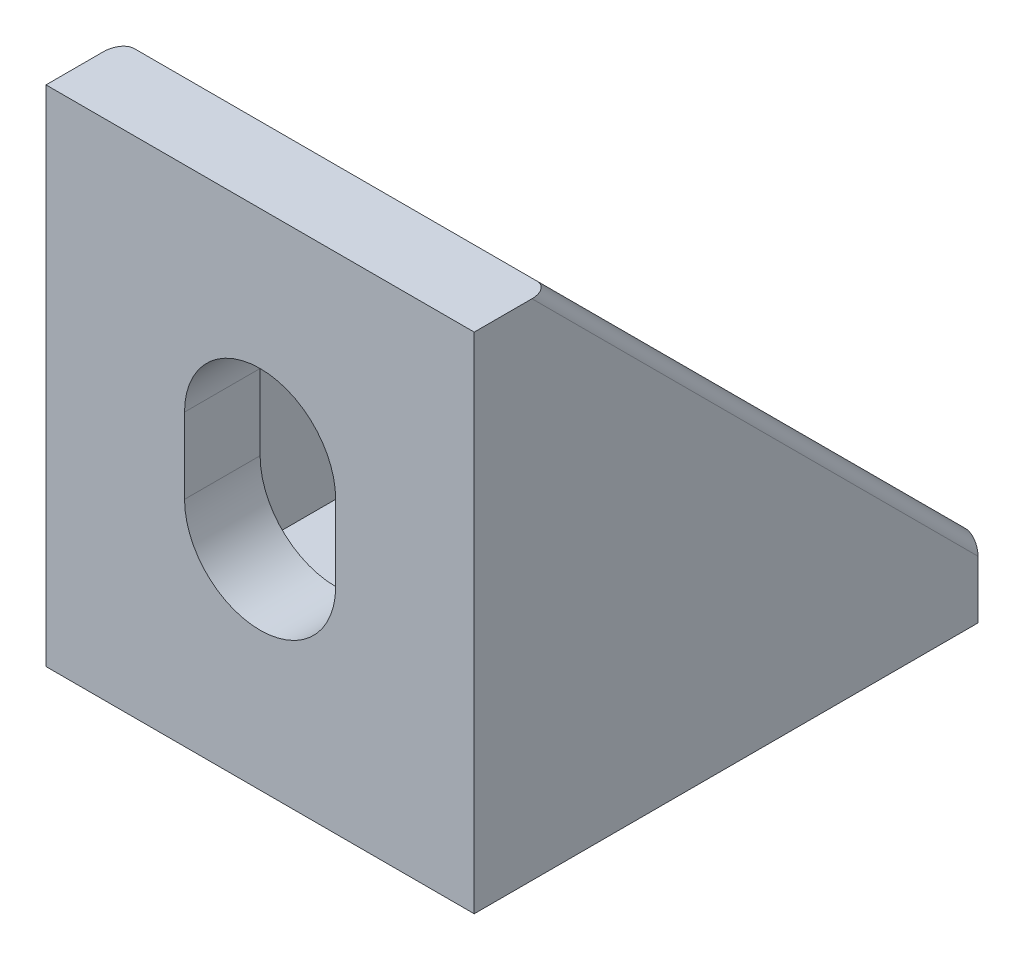
ISO-10303-21;
HEADER;
FILE_DESCRIPTION(('STEP AP214'),'2;1');
FILE_NAME('part.step','',(''),(''),'','','');
FILE_SCHEMA(('AUTOMOTIVE_DESIGN { 1 0 10303 214 1 1 1 1 }'));
ENDSEC;
DATA;
#1=APPLICATION_CONTEXT('core data for automotive mechanical design processes');
#2=APPLICATION_PROTOCOL_DEFINITION('international standard','automotive_design',2000,#1);
#3=PRODUCT_CONTEXT('',#1,'mechanical');
#4=PRODUCT('Part','Part','',(#3));
#5=PRODUCT_RELATED_PRODUCT_CATEGORY('part','',(#4));
#6=PRODUCT_DEFINITION_FORMATION('','',#4);
#7=PRODUCT_DEFINITION_CONTEXT('part definition',#1,'design');
#8=PRODUCT_DEFINITION('design','',#6,#7);
#9=PRODUCT_DEFINITION_SHAPE('','',#8);
#10=(LENGTH_UNIT() NAMED_UNIT(*) SI_UNIT(.MILLI.,.METRE.));
#11=(NAMED_UNIT(*) PLANE_ANGLE_UNIT() SI_UNIT($,.RADIAN.));
#12=(NAMED_UNIT(*) SI_UNIT($,.STERADIAN.) SOLID_ANGLE_UNIT());
#13=UNCERTAINTY_MEASURE_WITH_UNIT(LENGTH_MEASURE(1.E-05),#10,'distance_accuracy_value','');
#14=(GEOMETRIC_REPRESENTATION_CONTEXT(3) GLOBAL_UNCERTAINTY_ASSIGNED_CONTEXT((#13)) GLOBAL_UNIT_ASSIGNED_CONTEXT((#10,
#11,#12)) REPRESENTATION_CONTEXT('',''));
#15=CARTESIAN_POINT('',(0.,0.,0.));
#16=DIRECTION('',(0.,0.,1.));
#17=DIRECTION('',(1.,0.,0.));
#18=AXIS2_PLACEMENT_3D('',#15,#16,#17);
#19=CARTESIAN_POINT('',(8.5,3.,-3.));
#20=DIRECTION('',(0.,-1.,0.));
#21=DIRECTION('',(0.,0.,-1.));
#22=AXIS2_PLACEMENT_3D('',#19,#20,#21);
#23=PLANE('',#22);
#24=CARTESIAN_POINT('',(0.,3.,-8.5));
#25=DIRECTION('',(0.,1.,0.));
#26=DIRECTION('',(0.,0.,1.));
#27=AXIS2_PLACEMENT_3D('',#24,#25,#26);
#28=CIRCLE('',#27,3.);
#29=CARTESIAN_POINT('',(-3.00000000000009,3.,-8.5));
#30=VERTEX_POINT('',#29);
#31=CARTESIAN_POINT('',(3.,3.,-8.5));
#32=VERTEX_POINT('',#31);
#33=EDGE_CURVE('E239',#30,#32,#28,.T.);
#34=ORIENTED_EDGE('',*,*,#33,.F.);
#35=DIRECTION('',(0.,0.,-1.));
#36=VECTOR('',#35,1.);
#37=CARTESIAN_POINT('',(-3.,3.,-8.5));
#38=LINE('',#37,#36);
#39=CARTESIAN_POINT('',(-3.,3.,-11.5));
#40=VERTEX_POINT('',#39);
#41=EDGE_CURVE('E233',#30,#40,#38,.T.);
#42=ORIENTED_EDGE('',*,*,#41,.T.);
#43=CARTESIAN_POINT('',(0.,3.,-11.5));
#44=DIRECTION('',(0.,1.,0.));
#45=DIRECTION('',(0.,0.,1.));
#46=AXIS2_PLACEMENT_3D('',#43,#44,#45);
#47=CIRCLE('',#46,3.);
#48=CARTESIAN_POINT('',(3.,3.,-11.5));
#49=VERTEX_POINT('',#48);
#50=EDGE_CURVE('E251',#49,#40,#47,.T.);
#51=ORIENTED_EDGE('',*,*,#50,.F.);
#52=DIRECTION('',(0.,0.,-1.));
#53=VECTOR('',#52,1.);
#54=CARTESIAN_POINT('',(3.,3.,-8.5));
#55=LINE('',#54,#53);
#56=EDGE_CURVE('E224',#32,#49,#55,.T.);
#57=ORIENTED_EDGE('',*,*,#56,.F.);
#58=EDGE_LOOP('',(#34,#42,#51,#57));
#59=FACE_BOUND('',#58,.T.);
#60=DIRECTION('',(0.,0.,-1.));
#61=VECTOR('',#60,1.);
#62=CARTESIAN_POINT('',(-5.5,3.,-20.));
#63=LINE('',#62,#61);
#64=CARTESIAN_POINT('',(-5.5,3.,-3.5));
#65=VERTEX_POINT('',#64);
#66=CARTESIAN_POINT('',(-5.5,3.,-19.2928932188134));
#67=VERTEX_POINT('',#66);
#68=EDGE_CURVE('E187',#65,#67,#63,.T.);
#69=ORIENTED_EDGE('',*,*,#68,.F.);
#70=DIRECTION('',(-1.,0.,0.));
#71=VECTOR('',#70,1.);
#72=CARTESIAN_POINT('',(5.5,3.,-3.5));
#73=LINE('',#72,#71);
#74=CARTESIAN_POINT('',(5.5,3.,-3.5));
#75=VERTEX_POINT('',#74);
#76=EDGE_CURVE('E135',#65,#75,#73,.F.);
#77=ORIENTED_EDGE('',*,*,#76,.T.);
#78=DIRECTION('',(0.,0.,-1.));
#79=VECTOR('',#78,1.);
#80=CARTESIAN_POINT('',(5.5,3.,-20.));
#81=LINE('',#80,#79);
#82=CARTESIAN_POINT('',(5.5,3.,-19.2928932188134));
#83=VERTEX_POINT('',#82);
#84=EDGE_CURVE('E131',#75,#83,#81,.T.);
#85=ORIENTED_EDGE('',*,*,#84,.T.);
#86=CARTESIAN_POINT('',(6.,3.,-19.2928932188134));
#87=DIRECTION('',(0.,-1.,0.));
#88=DIRECTION('',(0.,0.,-1.));
#89=AXIS2_PLACEMENT_3D('',#86,#87,#88);
#90=ELLIPSE('',#89,0.707106781186548,0.5);
#91=CARTESIAN_POINT('',(6.,3.,-20.));
#92=VERTEX_POINT('',#91);
#93=EDGE_CURVE('E11',#83,#92,#90,.T.);
#94=ORIENTED_EDGE('',*,*,#93,.T.);
#95=DIRECTION('',(-1.,0.,0.));
#96=VECTOR('',#95,1.);
#97=CARTESIAN_POINT('',(8.5,3.,-20.));
#98=LINE('',#97,#96);
#99=CARTESIAN_POINT('',(-6.,3.,-20.));
#100=VERTEX_POINT('',#99);
#101=EDGE_CURVE('E32',#92,#100,#98,.T.);
#102=ORIENTED_EDGE('',*,*,#101,.T.);
#103=CARTESIAN_POINT('',(-6.,3.,-19.2928932188134));
#104=DIRECTION('',(0.,-1.,0.));
#105=DIRECTION('',(0.,0.,1.));
#106=AXIS2_PLACEMENT_3D('',#103,#104,#105);
#107=ELLIPSE('',#106,0.707106781186548,0.5);
#108=EDGE_CURVE('E106',#100,#67,#107,.T.);
#109=ORIENTED_EDGE('',*,*,#108,.T.);
#110=EDGE_LOOP('',(#69,#77,#85,#94,#102,#109));
#111=FACE_BOUND('',#110,.T.);
#112=ADVANCED_FACE('F17',(#59,#111),#23,.F.);
#113=CARTESIAN_POINT('',(8.5,20.,-3.));
#114=DIRECTION('',(0.,0.,1.));
#115=DIRECTION('',(1.,0.,0.));
#116=AXIS2_PLACEMENT_3D('',#113,#114,#115);
#117=PLANE('',#116);
#118=DIRECTION('',(0.,1.,0.));
#119=VECTOR('',#118,1.);
#120=CARTESIAN_POINT('',(3.,8.5,-3.));
#121=LINE('',#120,#119);
#122=CARTESIAN_POINT('',(3.,8.5,-3.));
#123=VERTEX_POINT('',#122);
#124=CARTESIAN_POINT('',(3.,11.5,-3.));
#125=VERTEX_POINT('',#124);
#126=EDGE_CURVE('E197',#123,#125,#121,.T.);
#127=ORIENTED_EDGE('',*,*,#126,.T.);
#128=CARTESIAN_POINT('',(0.,11.5,-3.));
#129=DIRECTION('',(0.,0.,-1.));
#130=DIRECTION('',(-1.,0.,0.));
#131=AXIS2_PLACEMENT_3D('',#128,#129,#130);
#132=CIRCLE('',#131,3.);
#133=CARTESIAN_POINT('',(-3.,11.5,-3.));
#134=VERTEX_POINT('',#133);
#135=EDGE_CURVE('E215',#134,#125,#132,.T.);
#136=ORIENTED_EDGE('',*,*,#135,.F.);
#137=DIRECTION('',(0.,1.,0.));
#138=VECTOR('',#137,1.);
#139=CARTESIAN_POINT('',(-3.,8.5,-3.));
#140=LINE('',#139,#138);
#141=CARTESIAN_POINT('',(-3.,8.5,-3.));
#142=VERTEX_POINT('',#141);
#143=EDGE_CURVE('E182',#142,#134,#140,.T.);
#144=ORIENTED_EDGE('',*,*,#143,.F.);
#145=CARTESIAN_POINT('',(0.,8.5,-3.));
#146=DIRECTION('',(0.,0.,-1.));
#147=DIRECTION('',(-1.,0.,0.));
#148=AXIS2_PLACEMENT_3D('',#145,#146,#147);
#149=CIRCLE('',#148,3.);
#150=EDGE_CURVE('E203',#123,#142,#149,.T.);
#151=ORIENTED_EDGE('',*,*,#150,.F.);
#152=EDGE_LOOP('',(#127,#136,#144,#151));
#153=FACE_BOUND('',#152,.T.);
#154=DIRECTION('',(0.,-1.,0.));
#155=VECTOR('',#154,1.);
#156=CARTESIAN_POINT('',(5.5,3.,-3.));
#157=LINE('',#156,#155);
#158=CARTESIAN_POINT('',(5.5,19.2928932188134,-3.));
#159=VERTEX_POINT('',#158);
#160=CARTESIAN_POINT('',(5.5,3.5,-3.));
#161=VERTEX_POINT('',#160);
#162=EDGE_CURVE('E114',#159,#161,#157,.T.);
#163=ORIENTED_EDGE('',*,*,#162,.T.);
#164=DIRECTION('',(-1.,0.,0.));
#165=VECTOR('',#164,1.);
#166=CARTESIAN_POINT('',(-5.5,3.5,-3.));
#167=LINE('',#166,#165);
#168=CARTESIAN_POINT('',(-5.5,3.5,-3.));
#169=VERTEX_POINT('',#168);
#170=EDGE_CURVE('E282',#161,#169,#167,.T.);
#171=ORIENTED_EDGE('',*,*,#170,.T.);
#172=DIRECTION('',(0.,-1.,0.));
#173=VECTOR('',#172,1.);
#174=CARTESIAN_POINT('',(-5.5,3.,-3.));
#175=LINE('',#174,#173);
#176=CARTESIAN_POINT('',(-5.5,19.2928932188134,-3.));
#177=VERTEX_POINT('',#176);
#178=EDGE_CURVE('E297',#177,#169,#175,.T.);
#179=ORIENTED_EDGE('',*,*,#178,.F.);
#180=CARTESIAN_POINT('',(-6.,19.2928932188134,-3.));
#181=DIRECTION('',(0.,0.,1.));
#182=DIRECTION('',(0.,1.,0.));
#183=AXIS2_PLACEMENT_3D('',#180,#181,#182);
#184=ELLIPSE('',#183,0.707106781186548,0.5);
#185=CARTESIAN_POINT('',(-6.,20.,-3.));
#186=VERTEX_POINT('',#185);
#187=EDGE_CURVE('E80',#177,#186,#184,.T.);
#188=ORIENTED_EDGE('',*,*,#187,.T.);
#189=DIRECTION('',(-1.,0.,0.));
#190=VECTOR('',#189,1.);
#191=CARTESIAN_POINT('',(8.5,20.,-3.));
#192=LINE('',#191,#190);
#193=CARTESIAN_POINT('',(6.,20.,-3.));
#194=VERTEX_POINT('',#193);
#195=EDGE_CURVE('E41',#194,#186,#192,.T.);
#196=ORIENTED_EDGE('',*,*,#195,.F.);
#197=CARTESIAN_POINT('',(6.,19.2928932188134,-3.));
#198=DIRECTION('',(0.,0.,1.));
#199=DIRECTION('',(0.,-1.,0.));
#200=AXIS2_PLACEMENT_3D('',#197,#198,#199);
#201=ELLIPSE('',#200,0.707106781186548,0.5);
#202=EDGE_CURVE('E25',#194,#159,#201,.T.);
#203=ORIENTED_EDGE('',*,*,#202,.T.);
#204=EDGE_LOOP('',(#163,#171,#179,#188,#196,#203));
#205=FACE_BOUND('',#204,.T.);
#206=ADVANCED_FACE('F111',(#153,#205),#117,.F.);
#207=CARTESIAN_POINT('',(8.5,20.,0.));
#208=DIRECTION('',(0.,0.,-1.));
#209=DIRECTION('',(0.,1.,0.));
#210=AXIS2_PLACEMENT_3D('',#207,#208,#209);
#211=PLANE('',#210);
#212=DIRECTION('',(0.,-1.,0.));
#213=VECTOR('',#212,1.);
#214=CARTESIAN_POINT('',(-8.5,20.,0.));
#215=LINE('',#214,#213);
#216=CARTESIAN_POINT('',(-8.5,20.,0.));
#217=VERTEX_POINT('',#216);
#218=CARTESIAN_POINT('',(-8.5,0.,0.));
#219=VERTEX_POINT('',#218);
#220=EDGE_CURVE('E168',#217,#219,#215,.T.);
#221=ORIENTED_EDGE('',*,*,#220,.T.);
#222=DIRECTION('',(-1.,0.,0.));
#223=VECTOR('',#222,1.);
#224=CARTESIAN_POINT('',(8.5,0.,0.));
#225=LINE('',#224,#223);
#226=CARTESIAN_POINT('',(8.5,0.,0.));
#227=VERTEX_POINT('',#226);
#228=EDGE_CURVE('E279',#227,#219,#225,.T.);
#229=ORIENTED_EDGE('',*,*,#228,.F.);
#230=DIRECTION('',(0.,-1.,0.));
#231=VECTOR('',#230,1.);
#232=CARTESIAN_POINT('',(8.5,20.,0.));
#233=LINE('',#232,#231);
#234=CARTESIAN_POINT('',(8.5,20.,0.));
#235=VERTEX_POINT('',#234);
#236=EDGE_CURVE('E169',#235,#227,#233,.T.);
#237=ORIENTED_EDGE('',*,*,#236,.F.);
#238=DIRECTION('',(-1.,0.,0.));
#239=VECTOR('',#238,1.);
#240=CARTESIAN_POINT('',(8.5,20.,0.));
#241=LINE('',#240,#239);
#242=EDGE_CURVE('E270',#235,#217,#241,.T.);
#243=ORIENTED_EDGE('',*,*,#242,.T.);
#244=EDGE_LOOP('',(#221,#229,#237,#243));
#245=FACE_BOUND('',#244,.T.);
#246=DIRECTION('',(0.,1.,0.));
#247=VECTOR('',#246,1.);
#248=CARTESIAN_POINT('',(3.,8.5,0.));
#249=LINE('',#248,#247);
#250=CARTESIAN_POINT('',(3.,8.5,0.));
#251=VERTEX_POINT('',#250);
#252=CARTESIAN_POINT('',(3.,11.5,0.));
#253=VERTEX_POINT('',#252);
#254=EDGE_CURVE('E194',#251,#253,#249,.T.);
#255=ORIENTED_EDGE('',*,*,#254,.F.);
#256=CARTESIAN_POINT('',(0.,8.5,0.));
#257=DIRECTION('',(0.,0.,-1.));
#258=DIRECTION('',(-1.,0.,0.));
#259=AXIS2_PLACEMENT_3D('',#256,#257,#258);
#260=CIRCLE('',#259,3.);
#261=CARTESIAN_POINT('',(-3.,8.5,0.));
#262=VERTEX_POINT('',#261);
#263=EDGE_CURVE('E206',#251,#262,#260,.T.);
#264=ORIENTED_EDGE('',*,*,#263,.T.);
#265=DIRECTION('',(0.,1.,0.));
#266=VECTOR('',#265,1.);
#267=CARTESIAN_POINT('',(-3.,8.5,0.));
#268=LINE('',#267,#266);
#269=CARTESIAN_POINT('',(-3.,11.5,0.));
#270=VERTEX_POINT('',#269);
#271=EDGE_CURVE('E185',#262,#270,#268,.T.);
#272=ORIENTED_EDGE('',*,*,#271,.T.);
#273=CARTESIAN_POINT('',(0.,11.5,0.));
#274=DIRECTION('',(0.,0.,-1.));
#275=DIRECTION('',(-1.,0.,0.));
#276=AXIS2_PLACEMENT_3D('',#273,#274,#275);
#277=CIRCLE('',#276,3.);
#278=EDGE_CURVE('E218',#270,#253,#277,.T.);
#279=ORIENTED_EDGE('',*,*,#278,.T.);
#280=EDGE_LOOP('',(#255,#264,#272,#279));
#281=FACE_BOUND('',#280,.T.);
#282=ADVANCED_FACE('F382',(#245,#281),#211,.F.);
#283=CARTESIAN_POINT('',(8.5,0.,0.));
#284=DIRECTION('',(0.,1.,0.));
#285=DIRECTION('',(0.,0.,1.));
#286=AXIS2_PLACEMENT_3D('',#283,#284,#285);
#287=PLANE('',#286);
#288=DIRECTION('',(0.,0.,-1.));
#289=VECTOR('',#288,1.);
#290=CARTESIAN_POINT('',(3.,0.,-8.5));
#291=LINE('',#290,#289);
#292=CARTESIAN_POINT('',(3.,0.,-8.5));
#293=VERTEX_POINT('',#292);
#294=CARTESIAN_POINT('',(3.,0.,-11.5));
#295=VERTEX_POINT('',#294);
#296=EDGE_CURVE('E227',#293,#295,#291,.T.);
#297=ORIENTED_EDGE('',*,*,#296,.T.);
#298=CARTESIAN_POINT('',(0.,0.,-11.5));
#299=DIRECTION('',(0.,1.,0.));
#300=DIRECTION('',(0.,0.,1.));
#301=AXIS2_PLACEMENT_3D('',#298,#299,#300);
#302=CIRCLE('',#301,3.);
#303=CARTESIAN_POINT('',(-3.,0.,-11.5));
#304=VERTEX_POINT('',#303);
#305=EDGE_CURVE('E254',#295,#304,#302,.T.);
#306=ORIENTED_EDGE('',*,*,#305,.T.);
#307=DIRECTION('',(0.,0.,-1.));
#308=VECTOR('',#307,1.);
#309=CARTESIAN_POINT('',(-3.,0.,-8.5));
#310=LINE('',#309,#308);
#311=CARTESIAN_POINT('',(-3.,0.,-8.5));
#312=VERTEX_POINT('',#311);
#313=EDGE_CURVE('E230',#312,#304,#310,.T.);
#314=ORIENTED_EDGE('',*,*,#313,.F.);
#315=CARTESIAN_POINT('',(0.,0.,-8.5));
#316=DIRECTION('',(0.,1.,0.));
#317=DIRECTION('',(0.,0.,1.));
#318=AXIS2_PLACEMENT_3D('',#315,#316,#317);
#319=CIRCLE('',#318,3.);
#320=EDGE_CURVE('E242',#312,#293,#319,.T.);
#321=ORIENTED_EDGE('',*,*,#320,.T.);
#322=EDGE_LOOP('',(#297,#306,#314,#321));
#323=FACE_BOUND('',#322,.T.);
#324=DIRECTION('',(0.,0.,-1.));
#325=VECTOR('',#324,1.);
#326=CARTESIAN_POINT('',(-8.5,0.,0.));
#327=LINE('',#326,#325);
#328=CARTESIAN_POINT('',(-8.5,0.,-20.));
#329=VERTEX_POINT('',#328);
#330=EDGE_CURVE('E272',#219,#329,#327,.T.);
#331=ORIENTED_EDGE('',*,*,#330,.T.);
#332=DIRECTION('',(-1.,0.,0.));
#333=VECTOR('',#332,1.);
#334=CARTESIAN_POINT('',(8.5,0.,-20.));
#335=LINE('',#334,#333);
#336=CARTESIAN_POINT('',(8.5,0.,-20.));
#337=VERTEX_POINT('',#336);
#338=EDGE_CURVE('E88',#337,#329,#335,.T.);
#339=ORIENTED_EDGE('',*,*,#338,.F.);
#340=DIRECTION('',(0.,0.,-1.));
#341=VECTOR('',#340,1.);
#342=CARTESIAN_POINT('',(8.5,0.,0.));
#343=LINE('',#342,#341);
#344=EDGE_CURVE('E262',#227,#337,#343,.T.);
#345=ORIENTED_EDGE('',*,*,#344,.F.);
#346=ORIENTED_EDGE('',*,*,#228,.T.);
#347=EDGE_LOOP('',(#331,#339,#345,#346));
#348=FACE_BOUND('',#347,.T.);
#349=ADVANCED_FACE('F384',(#323,#348),#287,.F.);
#350=CARTESIAN_POINT('',(8.5,0.,-20.));
#351=DIRECTION('',(0.,0.,1.));
#352=DIRECTION('',(1.,0.,0.));
#353=AXIS2_PLACEMENT_3D('',#350,#351,#352);
#354=PLANE('',#353);
#355=DIRECTION('',(0.,1.,0.));
#356=VECTOR('',#355,1.);
#357=CARTESIAN_POINT('',(-8.5,0.,-20.));
#358=LINE('',#357,#356);
#359=CARTESIAN_POINT('',(-8.5,2.29289321881346,-20.));
#360=VERTEX_POINT('',#359);
#361=EDGE_CURVE('E170',#329,#360,#358,.T.);
#362=ORIENTED_EDGE('',*,*,#361,.T.);
#363=CARTESIAN_POINT('',(-8.,2.29289321881346,-20.));
#364=DIRECTION('',(0.,0.,1.));
#365=DIRECTION('',(0.,1.,0.));
#366=AXIS2_PLACEMENT_3D('',#363,#364,#365);
#367=ELLIPSE('',#366,0.707106781186548,0.5);
#368=CARTESIAN_POINT('',(-8.,3.,-20.));
#369=VERTEX_POINT('',#368);
#370=EDGE_CURVE('E94',#360,#369,#367,.F.);
#371=ORIENTED_EDGE('',*,*,#370,.T.);
#372=DIRECTION('',(-1.,0.,0.));
#373=VECTOR('',#372,1.);
#374=CARTESIAN_POINT('',(-5.5,3.,-20.));
#375=LINE('',#374,#373);
#376=EDGE_CURVE('E175',#100,#369,#375,.T.);
#377=ORIENTED_EDGE('',*,*,#376,.F.);
#378=ORIENTED_EDGE('',*,*,#101,.F.);
#379=CARTESIAN_POINT('',(8.,3.,-20.));
#380=VERTEX_POINT('',#379);
#381=EDGE_CURVE('E76',#380,#92,#98,.T.);
#382=ORIENTED_EDGE('',*,*,#381,.F.);
#383=CARTESIAN_POINT('',(8.,2.29289321881345,-20.));
#384=DIRECTION('',(0.,0.,1.));
#385=DIRECTION('',(0.,1.,0.));
#386=AXIS2_PLACEMENT_3D('',#383,#384,#385);
#387=ELLIPSE('',#386,0.707106781186548,0.5);
#388=CARTESIAN_POINT('',(8.5,2.29289321881345,-20.));
#389=VERTEX_POINT('',#388);
#390=EDGE_CURVE('E86',#380,#389,#387,.F.);
#391=ORIENTED_EDGE('',*,*,#390,.T.);
#392=DIRECTION('',(0.,1.,0.));
#393=VECTOR('',#392,1.);
#394=CARTESIAN_POINT('',(8.5,0.,-20.));
#395=LINE('',#394,#393);
#396=EDGE_CURVE('E265',#337,#389,#395,.T.);
#397=ORIENTED_EDGE('',*,*,#396,.F.);
#398=ORIENTED_EDGE('',*,*,#338,.T.);
#399=EDGE_LOOP('',(#362,#371,#377,#378,#382,#391,#397,#398));
#400=FACE_BOUND('',#399,.T.);
#401=ADVANCED_FACE('F84',(#400),#354,.F.);
#402=CARTESIAN_POINT('',(8.5,20.,-3.));
#403=DIRECTION('',(0.,-1.,0.));
#404=DIRECTION('',(0.,0.,-1.));
#405=AXIS2_PLACEMENT_3D('',#402,#403,#404);
#406=PLANE('',#405);
#407=DIRECTION('',(-1.,0.,0.));
#408=VECTOR('',#407,1.);
#409=CARTESIAN_POINT('',(-5.5,20.,-3.));
#410=LINE('',#409,#408);
#411=CARTESIAN_POINT('',(-8.,20.,-3.));
#412=VERTEX_POINT('',#411);
#413=EDGE_CURVE('E158',#186,#412,#410,.T.);
#414=ORIENTED_EDGE('',*,*,#413,.T.);
#415=CARTESIAN_POINT('',(-8.,20.,-2.29289321881346));
#416=DIRECTION('',(0.,-1.,0.));
#417=DIRECTION('',(0.,0.,1.));
#418=AXIS2_PLACEMENT_3D('',#415,#416,#417);
#419=ELLIPSE('',#418,0.707106781186548,0.5);
#420=CARTESIAN_POINT('',(-8.5,20.,-2.29289321881346));
#421=VERTEX_POINT('',#420);
#422=EDGE_CURVE('E99',#412,#421,#419,.F.);
#423=ORIENTED_EDGE('',*,*,#422,.T.);
#424=DIRECTION('',(0.,0.,1.));
#425=VECTOR('',#424,1.);
#426=CARTESIAN_POINT('',(-8.5,20.,-3.));
#427=LINE('',#426,#425);
#428=EDGE_CURVE('E156',#421,#217,#427,.T.);
#429=ORIENTED_EDGE('',*,*,#428,.T.);
#430=ORIENTED_EDGE('',*,*,#242,.F.);
#431=DIRECTION('',(0.,0.,1.));
#432=VECTOR('',#431,1.);
#433=CARTESIAN_POINT('',(8.5,20.,-3.));
#434=LINE('',#433,#432);
#435=CARTESIAN_POINT('',(8.5,20.,-2.29289321881345));
#436=VERTEX_POINT('',#435);
#437=EDGE_CURVE('E267',#436,#235,#434,.T.);
#438=ORIENTED_EDGE('',*,*,#437,.F.);
#439=CARTESIAN_POINT('',(8.,20.,-2.29289321881345));
#440=DIRECTION('',(0.,-1.,0.));
#441=DIRECTION('',(0.,0.,1.));
#442=AXIS2_PLACEMENT_3D('',#439,#440,#441);
#443=ELLIPSE('',#442,0.707106781186548,0.5);
#444=CARTESIAN_POINT('',(8.,20.,-3.));
#445=VERTEX_POINT('',#444);
#446=EDGE_CURVE('E65',#436,#445,#443,.F.);
#447=ORIENTED_EDGE('',*,*,#446,.T.);
#448=EDGE_CURVE('E77',#445,#194,#192,.T.);
#449=ORIENTED_EDGE('',*,*,#448,.T.);
#450=ORIENTED_EDGE('',*,*,#195,.T.);
#451=EDGE_LOOP('',(#414,#423,#429,#430,#438,#447,#449,#450));
#452=FACE_BOUND('',#451,.T.);
#453=ADVANCED_FACE('F153',(#452),#406,.F.);
#454=CARTESIAN_POINT('',(8.5,0.,0.));
#455=DIRECTION('',(1.,0.,0.));
#456=DIRECTION('',(0.,0.,-1.));
#457=AXIS2_PLACEMENT_3D('',#454,#455,#456);
#458=PLANE('',#457);
#459=ORIENTED_EDGE('',*,*,#396,.T.);
#460=DIRECTION('',(0.,0.707106781186548,0.707106781186548));
#461=VECTOR('',#460,1.);
#462=CARTESIAN_POINT('',(8.5,11.1464466094067,-11.1464466094067));
#463=LINE('',#462,#461);
#464=EDGE_CURVE('E93',#389,#436,#463,.T.);
#465=ORIENTED_EDGE('',*,*,#464,.T.);
#466=ORIENTED_EDGE('',*,*,#437,.T.);
#467=ORIENTED_EDGE('',*,*,#236,.T.);
#468=ORIENTED_EDGE('',*,*,#344,.T.);
#469=EDGE_LOOP('',(#459,#465,#466,#467,#468));
#470=FACE_BOUND('',#469,.T.);
#471=ADVANCED_FACE('F411',(#470),#458,.T.);
#472=CARTESIAN_POINT('',(-8.5,0.,0.));
#473=DIRECTION('',(1.,0.,0.));
#474=DIRECTION('',(0.,0.,-1.));
#475=AXIS2_PLACEMENT_3D('',#472,#473,#474);
#476=PLANE('',#475);
#477=ORIENTED_EDGE('',*,*,#428,.F.);
#478=DIRECTION('',(0.,0.707106781186548,0.707106781186548));
#479=VECTOR('',#478,1.);
#480=CARTESIAN_POINT('',(-8.5,11.1464466094067,-11.1464466094067));
#481=LINE('',#480,#479);
#482=EDGE_CURVE('E95',#421,#360,#481,.F.);
#483=ORIENTED_EDGE('',*,*,#482,.T.);
#484=ORIENTED_EDGE('',*,*,#361,.F.);
#485=ORIENTED_EDGE('',*,*,#330,.F.);
#486=ORIENTED_EDGE('',*,*,#220,.F.);
#487=EDGE_LOOP('',(#477,#483,#484,#485,#486));
#488=FACE_BOUND('',#487,.T.);
#489=ADVANCED_FACE('F164',(#488),#476,.F.);
#490=CARTESIAN_POINT('',(5.5,20.,-3.));
#491=DIRECTION('',(0.,0.707106781186548,-0.707106781186548));
#492=DIRECTION('',(0.,0.707106781186548,0.707106781186548));
#493=AXIS2_PLACEMENT_3D('',#490,#491,#492);
#494=PLANE('',#493);
#495=ORIENTED_EDGE('',*,*,#448,.F.);
#496=DIRECTION('',(0.,0.707106781186548,0.707106781186548));
#497=VECTOR('',#496,1.);
#498=CARTESIAN_POINT('',(8.,20.,-3.));
#499=LINE('',#498,#497);
#500=EDGE_CURVE('E73',#445,#380,#499,.F.);
#501=ORIENTED_EDGE('',*,*,#500,.T.);
#502=ORIENTED_EDGE('',*,*,#381,.T.);
#503=DIRECTION('',(0.,0.707106781186548,0.707106781186548));
#504=VECTOR('',#503,1.);
#505=CARTESIAN_POINT('',(6.,20.,-3.));
#506=LINE('',#505,#504);
#507=EDGE_CURVE('E81',#92,#194,#506,.T.);
#508=ORIENTED_EDGE('',*,*,#507,.T.);
#509=EDGE_LOOP('',(#495,#501,#502,#508));
#510=FACE_BOUND('',#509,.T.);
#511=ADVANCED_FACE('F74',(#510),#494,.T.);
#512=CARTESIAN_POINT('',(5.5,0.,0.));
#513=DIRECTION('',(1.,0.,0.));
#514=DIRECTION('',(0.,0.,-1.));
#515=AXIS2_PLACEMENT_3D('',#512,#513,#514);
#516=PLANE('',#515);
#517=ORIENTED_EDGE('',*,*,#84,.F.);
#518=CARTESIAN_POINT('',(5.5,3.5,-3.5));
#519=DIRECTION('',(1.,0.,0.));
#520=DIRECTION('',(0.,0.,-1.));
#521=AXIS2_PLACEMENT_3D('',#518,#519,#520);
#522=CIRCLE('',#521,0.5);
#523=EDGE_CURVE('E130',#75,#161,#522,.F.);
#524=ORIENTED_EDGE('',*,*,#523,.T.);
#525=ORIENTED_EDGE('',*,*,#162,.F.);
#526=DIRECTION('',(0.,0.707106781186548,0.707106781186548));
#527=VECTOR('',#526,1.);
#528=CARTESIAN_POINT('',(5.5,2.64644660940673,-19.6464466094067));
#529=LINE('',#528,#527);
#530=EDGE_CURVE('E127',#159,#83,#529,.F.);
#531=ORIENTED_EDGE('',*,*,#530,.T.);
#532=EDGE_LOOP('',(#517,#524,#525,#531));
#533=FACE_BOUND('',#532,.T.);
#534=ADVANCED_FACE('F125',(#533),#516,.F.);
#535=CARTESIAN_POINT('',(0.,3.,-11.5));
#536=DIRECTION('',(0.,1.,0.));
#537=DIRECTION('',(0.,0.,1.));
#538=AXIS2_PLACEMENT_3D('',#535,#536,#537);
#539=CYLINDRICAL_SURFACE('',#538,3.);
#540=ORIENTED_EDGE('',*,*,#305,.F.);
#541=DIRECTION('',(0.,-1.,0.));
#542=VECTOR('',#541,1.);
#543=CARTESIAN_POINT('',(3.,0.,-11.5));
#544=LINE('',#543,#542);
#545=EDGE_CURVE('E248',#49,#295,#544,.T.);
#546=ORIENTED_EDGE('',*,*,#545,.F.);
#547=ORIENTED_EDGE('',*,*,#50,.T.);
#548=DIRECTION('',(0.,1.,0.));
#549=VECTOR('',#548,1.);
#550=CARTESIAN_POINT('',(-3.,3.,-11.5));
#551=LINE('',#550,#549);
#552=EDGE_CURVE('E132',#304,#40,#551,.T.);
#553=ORIENTED_EDGE('',*,*,#552,.F.);
#554=EDGE_LOOP('',(#540,#546,#547,#553));
#555=FACE_BOUND('',#554,.T.);
#556=ADVANCED_FACE('F425',(#555),#539,.F.);
#557=CARTESIAN_POINT('',(0.,3.,-8.5));
#558=DIRECTION('',(0.,1.,0.));
#559=DIRECTION('',(0.,0.,1.));
#560=AXIS2_PLACEMENT_3D('',#557,#558,#559);
#561=CYLINDRICAL_SURFACE('',#560,3.);
#562=ORIENTED_EDGE('',*,*,#33,.T.);
#563=DIRECTION('',(0.,-1.,0.));
#564=VECTOR('',#563,1.);
#565=CARTESIAN_POINT('',(3.,0.,-8.5));
#566=LINE('',#565,#564);
#567=EDGE_CURVE('E236',#32,#293,#566,.T.);
#568=ORIENTED_EDGE('',*,*,#567,.T.);
#569=ORIENTED_EDGE('',*,*,#320,.F.);
#570=DIRECTION('',(0.,1.,0.));
#571=VECTOR('',#570,1.);
#572=CARTESIAN_POINT('',(-3.,3.,-8.5));
#573=LINE('',#572,#571);
#574=EDGE_CURVE('E245',#30,#312,#573,.F.);
#575=ORIENTED_EDGE('',*,*,#574,.F.);
#576=EDGE_LOOP('',(#562,#568,#569,#575));
#577=FACE_BOUND('',#576,.T.);
#578=ADVANCED_FACE('F428',(#577),#561,.F.);
#579=CARTESIAN_POINT('',(-3.,3.,-8.5));
#580=DIRECTION('',(-1.,0.,0.));
#581=DIRECTION('',(0.,0.,1.));
#582=AXIS2_PLACEMENT_3D('',#579,#580,#581);
#583=PLANE('',#582);
#584=ORIENTED_EDGE('',*,*,#552,.T.);
#585=ORIENTED_EDGE('',*,*,#41,.F.);
#586=ORIENTED_EDGE('',*,*,#574,.T.);
#587=ORIENTED_EDGE('',*,*,#313,.T.);
#588=EDGE_LOOP('',(#584,#585,#586,#587));
#589=FACE_BOUND('',#588,.T.);
#590=ADVANCED_FACE('F432',(#589),#583,.F.);
#591=CARTESIAN_POINT('',(3.,0.,-8.5));
#592=DIRECTION('',(1.,0.,0.));
#593=DIRECTION('',(0.,1.,0.));
#594=AXIS2_PLACEMENT_3D('',#591,#592,#593);
#595=PLANE('',#594);
#596=ORIENTED_EDGE('',*,*,#545,.T.);
#597=ORIENTED_EDGE('',*,*,#296,.F.);
#598=ORIENTED_EDGE('',*,*,#567,.F.);
#599=ORIENTED_EDGE('',*,*,#56,.T.);
#600=EDGE_LOOP('',(#596,#597,#598,#599));
#601=FACE_BOUND('',#600,.T.);
#602=ADVANCED_FACE('F436',(#601),#595,.F.);
#603=CARTESIAN_POINT('',(0.,11.5,-3.));
#604=DIRECTION('',(0.,0.,-1.));
#605=DIRECTION('',(-1.,0.,0.));
#606=AXIS2_PLACEMENT_3D('',#603,#604,#605);
#607=CYLINDRICAL_SURFACE('',#606,3.);
#608=ORIENTED_EDGE('',*,*,#135,.T.);
#609=DIRECTION('',(0.,0.,1.));
#610=VECTOR('',#609,1.);
#611=CARTESIAN_POINT('',(3.,11.5,0.));
#612=LINE('',#611,#610);
#613=EDGE_CURVE('E212',#125,#253,#612,.T.);
#614=ORIENTED_EDGE('',*,*,#613,.T.);
#615=ORIENTED_EDGE('',*,*,#278,.F.);
#616=DIRECTION('',(0.,0.,-1.));
#617=VECTOR('',#616,1.);
#618=CARTESIAN_POINT('',(-3.,11.5,-3.));
#619=LINE('',#618,#617);
#620=EDGE_CURVE('E221',#134,#270,#619,.F.);
#621=ORIENTED_EDGE('',*,*,#620,.F.);
#622=EDGE_LOOP('',(#608,#614,#615,#621));
#623=FACE_BOUND('',#622,.T.);
#624=ADVANCED_FACE('F380',(#623),#607,.F.);
#625=CARTESIAN_POINT('',(0.,8.5,-3.));
#626=DIRECTION('',(0.,0.,-1.));
#627=DIRECTION('',(-1.,0.,0.));
#628=AXIS2_PLACEMENT_3D('',#625,#626,#627);
#629=CYLINDRICAL_SURFACE('',#628,3.);
#630=ORIENTED_EDGE('',*,*,#263,.F.);
#631=DIRECTION('',(0.,0.,1.));
#632=VECTOR('',#631,1.);
#633=CARTESIAN_POINT('',(3.,8.5,0.));
#634=LINE('',#633,#632);
#635=EDGE_CURVE('E200',#123,#251,#634,.T.);
#636=ORIENTED_EDGE('',*,*,#635,.F.);
#637=ORIENTED_EDGE('',*,*,#150,.T.);
#638=DIRECTION('',(0.,0.,-1.));
#639=VECTOR('',#638,1.);
#640=CARTESIAN_POINT('',(-3.,8.5,-3.));
#641=LINE('',#640,#639);
#642=EDGE_CURVE('E209',#262,#142,#641,.T.);
#643=ORIENTED_EDGE('',*,*,#642,.F.);
#644=EDGE_LOOP('',(#630,#636,#637,#643));
#645=FACE_BOUND('',#644,.T.);
#646=ADVANCED_FACE('F373',(#645),#629,.F.);
#647=CARTESIAN_POINT('',(3.,8.5,0.));
#648=DIRECTION('',(-1.,0.,0.));
#649=DIRECTION('',(0.,0.,1.));
#650=AXIS2_PLACEMENT_3D('',#647,#648,#649);
#651=PLANE('',#650);
#652=ORIENTED_EDGE('',*,*,#613,.F.);
#653=ORIENTED_EDGE('',*,*,#126,.F.);
#654=ORIENTED_EDGE('',*,*,#635,.T.);
#655=ORIENTED_EDGE('',*,*,#254,.T.);
#656=EDGE_LOOP('',(#652,#653,#654,#655));
#657=FACE_BOUND('',#656,.T.);
#658=ADVANCED_FACE('F367',(#657),#651,.T.);
#659=CARTESIAN_POINT('',(-3.,8.5,-3.));
#660=DIRECTION('',(-1.,0.,0.));
#661=DIRECTION('',(0.,-1.,0.));
#662=AXIS2_PLACEMENT_3D('',#659,#660,#661);
#663=PLANE('',#662);
#664=ORIENTED_EDGE('',*,*,#620,.T.);
#665=ORIENTED_EDGE('',*,*,#271,.F.);
#666=ORIENTED_EDGE('',*,*,#642,.T.);
#667=ORIENTED_EDGE('',*,*,#143,.T.);
#668=EDGE_LOOP('',(#664,#665,#666,#667));
#669=FACE_BOUND('',#668,.T.);
#670=ADVANCED_FACE('F378',(#669),#663,.F.);
#671=CARTESIAN_POINT('',(-5.5,20.,-3.));
#672=DIRECTION('',(0.,-0.707106781186548,0.707106781186548));
#673=DIRECTION('',(0.,-0.707106781186548,-0.707106781186548));
#674=AXIS2_PLACEMENT_3D('',#671,#672,#673);
#675=PLANE('',#674);
#676=ORIENTED_EDGE('',*,*,#413,.F.);
#677=DIRECTION('',(0.,0.707106781186548,0.707106781186548));
#678=VECTOR('',#677,1.);
#679=CARTESIAN_POINT('',(-6.,20.,-3.));
#680=LINE('',#679,#678);
#681=EDGE_CURVE('E146',#186,#100,#680,.F.);
#682=ORIENTED_EDGE('',*,*,#681,.T.);
#683=ORIENTED_EDGE('',*,*,#376,.T.);
#684=DIRECTION('',(0.,0.707106781186548,0.707106781186548));
#685=VECTOR('',#684,1.);
#686=CARTESIAN_POINT('',(-8.,20.,-3.));
#687=LINE('',#686,#685);
#688=EDGE_CURVE('E137',#369,#412,#687,.T.);
#689=ORIENTED_EDGE('',*,*,#688,.T.);
#690=EDGE_LOOP('',(#676,#682,#683,#689));
#691=FACE_BOUND('',#690,.T.);
#692=ADVANCED_FACE('F180',(#691),#675,.F.);
#693=CARTESIAN_POINT('',(-5.5,0.,0.));
#694=DIRECTION('',(-1.,0.,0.));
#695=DIRECTION('',(0.,0.,-1.));
#696=AXIS2_PLACEMENT_3D('',#693,#694,#695);
#697=PLANE('',#696);
#698=ORIENTED_EDGE('',*,*,#178,.T.);
#699=CARTESIAN_POINT('',(-5.5,3.5,-3.5));
#700=DIRECTION('',(-1.,0.,0.));
#701=DIRECTION('',(0.,0.,1.));
#702=AXIS2_PLACEMENT_3D('',#699,#700,#701);
#703=CIRCLE('',#702,0.5);
#704=EDGE_CURVE('E140',#169,#65,#703,.F.);
#705=ORIENTED_EDGE('',*,*,#704,.T.);
#706=ORIENTED_EDGE('',*,*,#68,.T.);
#707=DIRECTION('',(0.,0.707106781186548,0.707106781186548));
#708=VECTOR('',#707,1.);
#709=CARTESIAN_POINT('',(-5.5,11.1464466094067,-11.1464466094067));
#710=LINE('',#709,#708);
#711=EDGE_CURVE('E284',#67,#177,#710,.T.);
#712=ORIENTED_EDGE('',*,*,#711,.T.);
#713=EDGE_LOOP('',(#698,#705,#706,#712));
#714=FACE_BOUND('',#713,.T.);
#715=ADVANCED_FACE('F293',(#714),#697,.F.);
#716=CARTESIAN_POINT('',(8.5,3.5,-3.5));
#717=DIRECTION('',(1.,0.,0.));
#718=DIRECTION('',(0.,0.,-1.));
#719=AXIS2_PLACEMENT_3D('',#716,#717,#718);
#720=CYLINDRICAL_SURFACE('',#719,0.5);
#721=ORIENTED_EDGE('',*,*,#523,.F.);
#722=ORIENTED_EDGE('',*,*,#76,.F.);
#723=ORIENTED_EDGE('',*,*,#704,.F.);
#724=ORIENTED_EDGE('',*,*,#170,.F.);
#725=EDGE_LOOP('',(#721,#722,#723,#724));
#726=FACE_BOUND('',#725,.T.);
#727=ADVANCED_FACE('F303',(#726),#720,.F.);
#728=CARTESIAN_POINT('',(-6.,11.1464466094067,-11.1464466094067));
#729=DIRECTION('',(0.,0.707106781186548,0.707106781186548));
#730=DIRECTION('',(0.,-0.707106781186548,0.707106781186548));
#731=AXIS2_PLACEMENT_3D('',#728,#729,#730);
#732=CYLINDRICAL_SURFACE('',#731,0.5);
#733=ORIENTED_EDGE('',*,*,#108,.F.);
#734=ORIENTED_EDGE('',*,*,#681,.F.);
#735=ORIENTED_EDGE('',*,*,#187,.F.);
#736=ORIENTED_EDGE('',*,*,#711,.F.);
#737=EDGE_LOOP('',(#733,#734,#735,#736));
#738=FACE_BOUND('',#737,.T.);
#739=ADVANCED_FACE('F456',(#738),#732,.T.);
#740=CARTESIAN_POINT('',(-8.,19.6464466094067,-2.64644660940673));
#741=DIRECTION('',(0.,0.707106781186548,0.707106781186548));
#742=DIRECTION('',(0.,-0.707106781186548,0.707106781186548));
#743=AXIS2_PLACEMENT_3D('',#740,#741,#742);
#744=CYLINDRICAL_SURFACE('',#743,0.5);
#745=ORIENTED_EDGE('',*,*,#370,.F.);
#746=ORIENTED_EDGE('',*,*,#482,.F.);
#747=ORIENTED_EDGE('',*,*,#422,.F.);
#748=ORIENTED_EDGE('',*,*,#688,.F.);
#749=EDGE_LOOP('',(#745,#746,#747,#748));
#750=FACE_BOUND('',#749,.T.);
#751=ADVANCED_FACE('F173',(#750),#744,.T.);
#752=CARTESIAN_POINT('',(8.,11.1464466094067,-11.1464466094067));
#753=DIRECTION('',(0.,0.707106781186548,0.707106781186548));
#754=DIRECTION('',(0.,-0.707106781186548,0.707106781186548));
#755=AXIS2_PLACEMENT_3D('',#752,#753,#754);
#756=CYLINDRICAL_SURFACE('',#755,0.5);
#757=ORIENTED_EDGE('',*,*,#390,.F.);
#758=ORIENTED_EDGE('',*,*,#500,.F.);
#759=ORIENTED_EDGE('',*,*,#446,.F.);
#760=ORIENTED_EDGE('',*,*,#464,.F.);
#761=EDGE_LOOP('',(#757,#758,#759,#760));
#762=FACE_BOUND('',#761,.T.);
#763=ADVANCED_FACE('F91',(#762),#756,.T.);
#764=CARTESIAN_POINT('',(6.,19.6464466094067,-2.64644660940673));
#765=DIRECTION('',(0.,-0.707106781186548,-0.707106781186548));
#766=DIRECTION('',(0.,0.707106781186548,-0.707106781186548));
#767=AXIS2_PLACEMENT_3D('',#764,#765,#766);
#768=CYLINDRICAL_SURFACE('',#767,0.5);
#769=ORIENTED_EDGE('',*,*,#93,.F.);
#770=ORIENTED_EDGE('',*,*,#530,.F.);
#771=ORIENTED_EDGE('',*,*,#202,.F.);
#772=ORIENTED_EDGE('',*,*,#507,.F.);
#773=EDGE_LOOP('',(#769,#770,#771,#772));
#774=FACE_BOUND('',#773,.T.);
#775=ADVANCED_FACE('F19',(#774),#768,.T.);
#776=CLOSED_SHELL('',(#112,#206,#282,#349,#401,#453,#471,#489,#511,#534,#556,#578,#590,#602,
#624,#646,#658,#670,#692,#715,#727,#739,#751,#763,#775));
#777=MANIFOLD_SOLID_BREP('B1',#776);
#778=ADVANCED_BREP_SHAPE_REPRESENTATION('',(#18,#777),#14);
#779=SHAPE_DEFINITION_REPRESENTATION(#9,#778);
ENDSEC;
END-ISO-10303-21;
